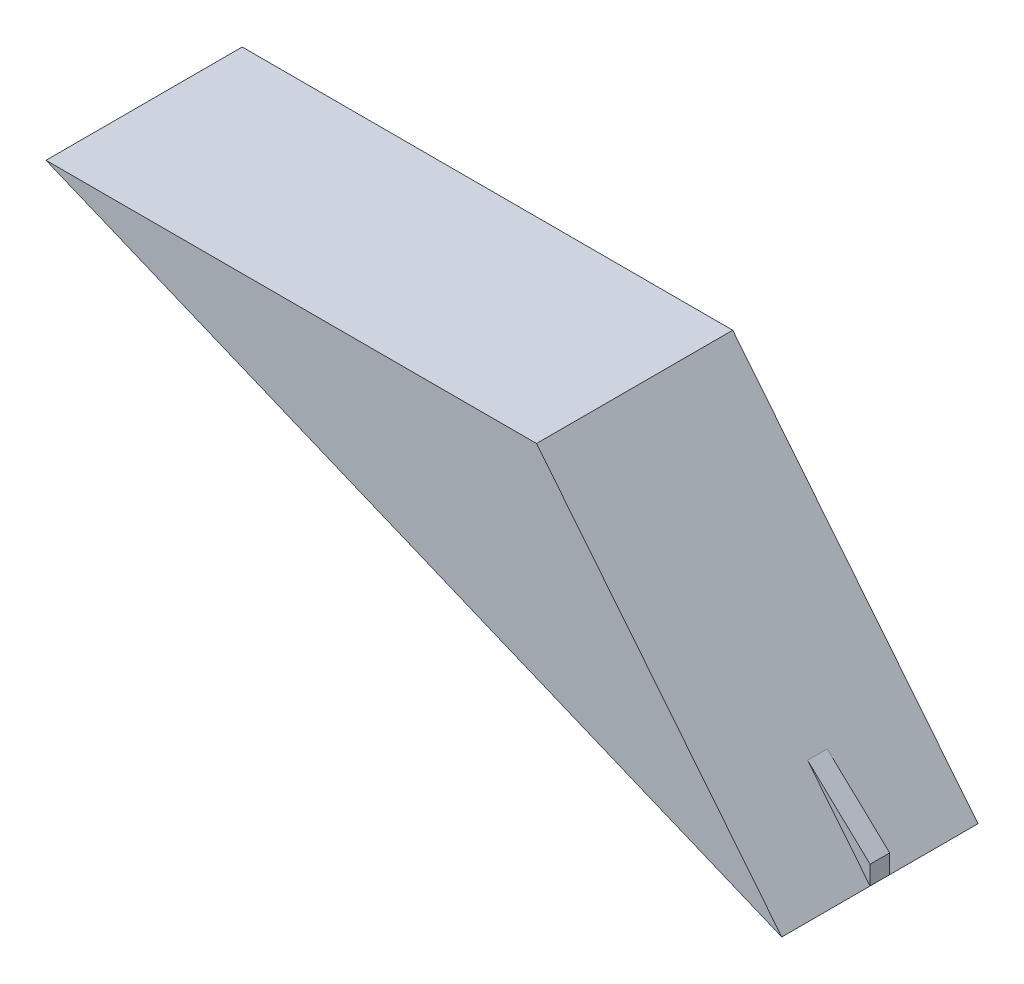
ISO-10303-21;
HEADER;
FILE_DESCRIPTION(('STEP AP214'),'2;1');
FILE_NAME('part.step','',(''),(''),'','','');
FILE_SCHEMA(('AUTOMOTIVE_DESIGN { 1 0 10303 214 1 1 1 1 }'));
ENDSEC;
DATA;
#1=APPLICATION_CONTEXT('core data for automotive mechanical design processes');
#2=APPLICATION_PROTOCOL_DEFINITION('international standard','automotive_design',2000,#1);
#3=PRODUCT_CONTEXT('',#1,'mechanical');
#4=PRODUCT('Part','Part','',(#3));
#5=PRODUCT_RELATED_PRODUCT_CATEGORY('part','',(#4));
#6=PRODUCT_DEFINITION_FORMATION('','',#4);
#7=PRODUCT_DEFINITION_CONTEXT('part definition',#1,'design');
#8=PRODUCT_DEFINITION('design','',#6,#7);
#9=PRODUCT_DEFINITION_SHAPE('','',#8);
#10=(LENGTH_UNIT() NAMED_UNIT(*) SI_UNIT(.MILLI.,.METRE.));
#11=(NAMED_UNIT(*) PLANE_ANGLE_UNIT() SI_UNIT($,.RADIAN.));
#12=(NAMED_UNIT(*) SI_UNIT($,.STERADIAN.) SOLID_ANGLE_UNIT());
#13=UNCERTAINTY_MEASURE_WITH_UNIT(LENGTH_MEASURE(1.E-05),#10,'distance_accuracy_value','');
#14=(GEOMETRIC_REPRESENTATION_CONTEXT(3) GLOBAL_UNCERTAINTY_ASSIGNED_CONTEXT((#13)) GLOBAL_UNIT_ASSIGNED_CONTEXT((#10,
#11,#12)) REPRESENTATION_CONTEXT('',''));
#15=CARTESIAN_POINT('',(0.,0.,0.));
#16=DIRECTION('',(0.,0.,1.));
#17=DIRECTION('',(1.,0.,0.));
#18=AXIS2_PLACEMENT_3D('',#15,#16,#17);
#19=CARTESIAN_POINT('',(500.,0.,100.));
#20=DIRECTION('',(-0.779065031064218,-0.62694312132195,0.));
#21=DIRECTION('',(0.62694312132195,-0.779065031064218,0.));
#22=AXIS2_PLACEMENT_3D('',#19,#20,#21);
#23=PLANE('',#22);
#24=DIRECTION('',(0.62694312132195,-0.779065031064218,0.));
#25=VECTOR('',#24,1.);
#26=CARTESIAN_POINT('',(500.,0.,9.99999999999999));
#27=LINE('',#26,#25);
#28=CARTESIAN_POINT('',(686.273799005655,-231.471401588707,10.));
#29=VERTEX_POINT('',#28);
#30=CARTESIAN_POINT('',(750.,-310.660171779822,10.));
#31=VERTEX_POINT('',#30);
#32=EDGE_CURVE('E11',#29,#31,#27,.T.);
#33=ORIENTED_EDGE('',*,*,#32,.F.);
#34=DIRECTION('',(0.,0.,-1.));
#35=VECTOR('',#34,1.);
#36=CARTESIAN_POINT('',(686.273799005655,-231.471401588707,10.));
#37=LINE('',#36,#35);
#38=CARTESIAN_POINT('',(686.273799005655,-231.471401588707,-10.));
#39=VERTEX_POINT('',#38);
#40=EDGE_CURVE('E153',#29,#39,#37,.T.);
#41=ORIENTED_EDGE('',*,*,#40,.T.);
#42=DIRECTION('',(0.62694312132195,-0.779065031064218,0.));
#43=VECTOR('',#42,1.);
#44=CARTESIAN_POINT('',(500.,0.,-10.));
#45=LINE('',#44,#43);
#46=CARTESIAN_POINT('',(750.,-310.660171779822,-10.));
#47=VERTEX_POINT('',#46);
#48=EDGE_CURVE('E48',#39,#47,#45,.T.);
#49=ORIENTED_EDGE('',*,*,#48,.T.);
#50=DIRECTION('',(0.,0.,-1.));
#51=VECTOR('',#50,1.);
#52=CARTESIAN_POINT('',(750.,-310.660171779822,100.));
#53=LINE('',#52,#51);
#54=CARTESIAN_POINT('',(750.,-310.660171779822,-100.));
#55=VERTEX_POINT('',#54);
#56=EDGE_CURVE('E121',#47,#55,#53,.T.);
#57=ORIENTED_EDGE('',*,*,#56,.T.);
#58=DIRECTION('',(-0.62694312132195,0.779065031064218,0.));
#59=VECTOR('',#58,1.);
#60=CARTESIAN_POINT('',(500.,0.,-100.));
#61=LINE('',#60,#59);
#62=CARTESIAN_POINT('',(500.,0.,-100.));
#63=VERTEX_POINT('',#62);
#64=EDGE_CURVE('E140',#55,#63,#61,.T.);
#65=ORIENTED_EDGE('',*,*,#64,.T.);
#66=DIRECTION('',(0.,0.,-1.));
#67=VECTOR('',#66,1.);
#68=CARTESIAN_POINT('',(500.,0.,100.));
#69=LINE('',#68,#67);
#70=CARTESIAN_POINT('',(500.,0.,100.));
#71=VERTEX_POINT('',#70);
#72=EDGE_CURVE('E130',#71,#63,#69,.T.);
#73=ORIENTED_EDGE('',*,*,#72,.F.);
#74=DIRECTION('',(-0.62694312132195,0.779065031064218,0.));
#75=VECTOR('',#74,1.);
#76=CARTESIAN_POINT('',(500.,0.,100.));
#77=LINE('',#76,#75);
#78=CARTESIAN_POINT('',(750.,-310.660171779822,100.));
#79=VERTEX_POINT('',#78);
#80=EDGE_CURVE('E87',#79,#71,#77,.T.);
#81=ORIENTED_EDGE('',*,*,#80,.F.);
#82=EDGE_CURVE('E119',#79,#31,#53,.T.);
#83=ORIENTED_EDGE('',*,*,#82,.T.);
#84=EDGE_LOOP('',(#33,#41,#49,#57,#65,#73,#81,#83));
#85=FACE_BOUND('',#84,.T.);
#86=ADVANCED_FACE('F39',(#85),#23,.F.);
#87=CARTESIAN_POINT('',(0.,0.,100.));
#88=DIRECTION('',(0.382683432365091,0.923879532511286,0.));
#89=DIRECTION('',(-0.923879532511286,0.382683432365091,0.));
#90=AXIS2_PLACEMENT_3D('',#87,#88,#89);
#91=PLANE('',#90);
#92=DIRECTION('',(0.,0.,-1.));
#93=VECTOR('',#92,1.);
#94=CARTESIAN_POINT('',(750.,-310.660171779822,10.));
#95=LINE('',#94,#93);
#96=EDGE_CURVE('E55',#31,#47,#95,.T.);
#97=ORIENTED_EDGE('',*,*,#96,.F.);
#98=ORIENTED_EDGE('',*,*,#82,.F.);
#99=DIRECTION('',(0.923879532511286,-0.382683432365091,0.));
#100=VECTOR('',#99,1.);
#101=CARTESIAN_POINT('',(0.,0.,100.));
#102=LINE('',#101,#100);
#103=CARTESIAN_POINT('',(0.,0.,100.));
#104=VERTEX_POINT('',#103);
#105=EDGE_CURVE('E139',#104,#79,#102,.T.);
#106=ORIENTED_EDGE('',*,*,#105,.F.);
#107=DIRECTION('',(0.,0.,-1.));
#108=VECTOR('',#107,1.);
#109=CARTESIAN_POINT('',(0.,0.,100.));
#110=LINE('',#109,#108);
#111=CARTESIAN_POINT('',(0.,0.,-100.));
#112=VERTEX_POINT('',#111);
#113=EDGE_CURVE('E134',#104,#112,#110,.T.);
#114=ORIENTED_EDGE('',*,*,#113,.T.);
#115=DIRECTION('',(0.923879532511286,-0.382683432365091,0.));
#116=VECTOR('',#115,1.);
#117=CARTESIAN_POINT('',(0.,0.,-100.));
#118=LINE('',#117,#116);
#119=EDGE_CURVE('E123',#112,#55,#118,.T.);
#120=ORIENTED_EDGE('',*,*,#119,.T.);
#121=ORIENTED_EDGE('',*,*,#56,.F.);
#122=EDGE_LOOP('',(#97,#98,#106,#114,#120,#121));
#123=FACE_BOUND('',#122,.T.);
#124=ADVANCED_FACE('F41',(#123),#91,.F.);
#125=CARTESIAN_POINT('',(0.,0.,100.));
#126=DIRECTION('',(0.,-1.,0.));
#127=DIRECTION('',(0.,0.,-1.));
#128=AXIS2_PLACEMENT_3D('',#125,#126,#127);
#129=PLANE('',#128);
#130=DIRECTION('',(-1.,0.,0.));
#131=VECTOR('',#130,1.);
#132=CARTESIAN_POINT('',(0.,0.,-100.));
#133=LINE('',#132,#131);
#134=EDGE_CURVE('E81',#63,#112,#133,.T.);
#135=ORIENTED_EDGE('',*,*,#134,.T.);
#136=ORIENTED_EDGE('',*,*,#113,.F.);
#137=DIRECTION('',(-1.,0.,0.));
#138=VECTOR('',#137,1.);
#139=CARTESIAN_POINT('',(0.,0.,100.));
#140=LINE('',#139,#138);
#141=EDGE_CURVE('E64',#71,#104,#140,.T.);
#142=ORIENTED_EDGE('',*,*,#141,.F.);
#143=ORIENTED_EDGE('',*,*,#72,.T.);
#144=EDGE_LOOP('',(#135,#136,#142,#143));
#145=FACE_BOUND('',#144,.T.);
#146=ADVANCED_FACE('F172',(#145),#129,.F.);
#147=CARTESIAN_POINT('',(0.,0.,100.));
#148=DIRECTION('',(0.,0.,-1.));
#149=DIRECTION('',(-1.,0.,0.));
#150=AXIS2_PLACEMENT_3D('',#147,#148,#149);
#151=PLANE('',#150);
#152=ORIENTED_EDGE('',*,*,#105,.T.);
#153=ORIENTED_EDGE('',*,*,#80,.T.);
#154=ORIENTED_EDGE('',*,*,#141,.T.);
#155=EDGE_LOOP('',(#152,#153,#154));
#156=FACE_BOUND('',#155,.T.);
#157=ADVANCED_FACE('F174',(#156),#151,.F.);
#158=CARTESIAN_POINT('',(0.,0.,-100.));
#159=DIRECTION('',(0.,0.,-1.));
#160=DIRECTION('',(-1.,0.,0.));
#161=AXIS2_PLACEMENT_3D('',#158,#159,#160);
#162=PLANE('',#161);
#163=ORIENTED_EDGE('',*,*,#119,.F.);
#164=ORIENTED_EDGE('',*,*,#134,.F.);
#165=ORIENTED_EDGE('',*,*,#64,.F.);
#166=EDGE_LOOP('',(#163,#164,#165));
#167=FACE_BOUND('',#166,.T.);
#168=ADVANCED_FACE('F171',(#167),#162,.T.);
#169=CARTESIAN_POINT('',(0.,0.,10.));
#170=DIRECTION('',(0.,0.,-1.));
#171=DIRECTION('',(-1.,0.,0.));
#172=AXIS2_PLACEMENT_3D('',#169,#170,#171);
#173=PLANE('',#172);
#174=DIRECTION('',(-0.728429516974379,0.685120747606196,0.));
#175=VECTOR('',#174,1.);
#176=CARTESIAN_POINT('',(686.273799005655,-231.471401588707,10.));
#177=LINE('',#176,#175);
#178=CARTESIAN_POINT('',(750.,-291.408761964624,10.));
#179=VERTEX_POINT('',#178);
#180=EDGE_CURVE('E106',#179,#29,#177,.T.);
#181=ORIENTED_EDGE('',*,*,#180,.T.);
#182=ORIENTED_EDGE('',*,*,#32,.T.);
#183=DIRECTION('',(0.,1.,0.));
#184=VECTOR('',#183,1.);
#185=CARTESIAN_POINT('',(750.,-291.408761964624,10.));
#186=LINE('',#185,#184);
#187=EDGE_CURVE('E103',#31,#179,#186,.T.);
#188=ORIENTED_EDGE('',*,*,#187,.T.);
#189=EDGE_LOOP('',(#181,#182,#188));
#190=FACE_BOUND('',#189,.T.);
#191=ADVANCED_FACE('F102',(#190),#173,.F.);
#192=CARTESIAN_POINT('',(0.,0.,-10.));
#193=DIRECTION('',(0.,0.,-1.));
#194=DIRECTION('',(-1.,0.,0.));
#195=AXIS2_PLACEMENT_3D('',#192,#193,#194);
#196=PLANE('',#195);
#197=ORIENTED_EDGE('',*,*,#48,.F.);
#198=DIRECTION('',(-0.728429516974379,0.685120747606196,0.));
#199=VECTOR('',#198,1.);
#200=CARTESIAN_POINT('',(686.273799005655,-231.471401588707,-10.));
#201=LINE('',#200,#199);
#202=CARTESIAN_POINT('',(750.,-291.408761964624,-10.));
#203=VERTEX_POINT('',#202);
#204=EDGE_CURVE('E113',#203,#39,#201,.T.);
#205=ORIENTED_EDGE('',*,*,#204,.F.);
#206=DIRECTION('',(0.,1.,0.));
#207=VECTOR('',#206,1.);
#208=CARTESIAN_POINT('',(750.,-291.408761964624,-10.));
#209=LINE('',#208,#207);
#210=EDGE_CURVE('E159',#47,#203,#209,.T.);
#211=ORIENTED_EDGE('',*,*,#210,.F.);
#212=EDGE_LOOP('',(#197,#205,#211));
#213=FACE_BOUND('',#212,.T.);
#214=ADVANCED_FACE('F167',(#213),#196,.T.);
#215=CARTESIAN_POINT('',(750.,-291.408761964624,10.));
#216=DIRECTION('',(-1.,0.,0.));
#217=DIRECTION('',(0.,0.,1.));
#218=AXIS2_PLACEMENT_3D('',#215,#216,#217);
#219=PLANE('',#218);
#220=ORIENTED_EDGE('',*,*,#210,.T.);
#221=DIRECTION('',(0.,0.,-1.));
#222=VECTOR('',#221,1.);
#223=CARTESIAN_POINT('',(750.,-291.408761964624,10.));
#224=LINE('',#223,#222);
#225=EDGE_CURVE('E111',#179,#203,#224,.T.);
#226=ORIENTED_EDGE('',*,*,#225,.F.);
#227=ORIENTED_EDGE('',*,*,#187,.F.);
#228=ORIENTED_EDGE('',*,*,#96,.T.);
#229=EDGE_LOOP('',(#220,#226,#227,#228));
#230=FACE_BOUND('',#229,.T.);
#231=ADVANCED_FACE('F109',(#230),#219,.F.);
#232=CARTESIAN_POINT('',(686.273799005655,-231.471401588707,10.));
#233=DIRECTION('',(-0.685120747606196,-0.728429516974379,0.));
#234=DIRECTION('',(0.728429516974379,-0.685120747606196,0.));
#235=AXIS2_PLACEMENT_3D('',#232,#233,#234);
#236=PLANE('',#235);
#237=ORIENTED_EDGE('',*,*,#204,.T.);
#238=ORIENTED_EDGE('',*,*,#40,.F.);
#239=ORIENTED_EDGE('',*,*,#180,.F.);
#240=ORIENTED_EDGE('',*,*,#225,.T.);
#241=EDGE_LOOP('',(#237,#238,#239,#240));
#242=FACE_BOUND('',#241,.T.);
#243=ADVANCED_FACE('F166',(#242),#236,.F.);
#244=CLOSED_SHELL('',(#86,#124,#146,#157,#168,#191,#214,#231,#243));
#245=MANIFOLD_SOLID_BREP('B2',#244);
#246=ADVANCED_BREP_SHAPE_REPRESENTATION('',(#18,#245),#14);
#247=SHAPE_DEFINITION_REPRESENTATION(#9,#246);
ENDSEC;
END-ISO-10303-21;
